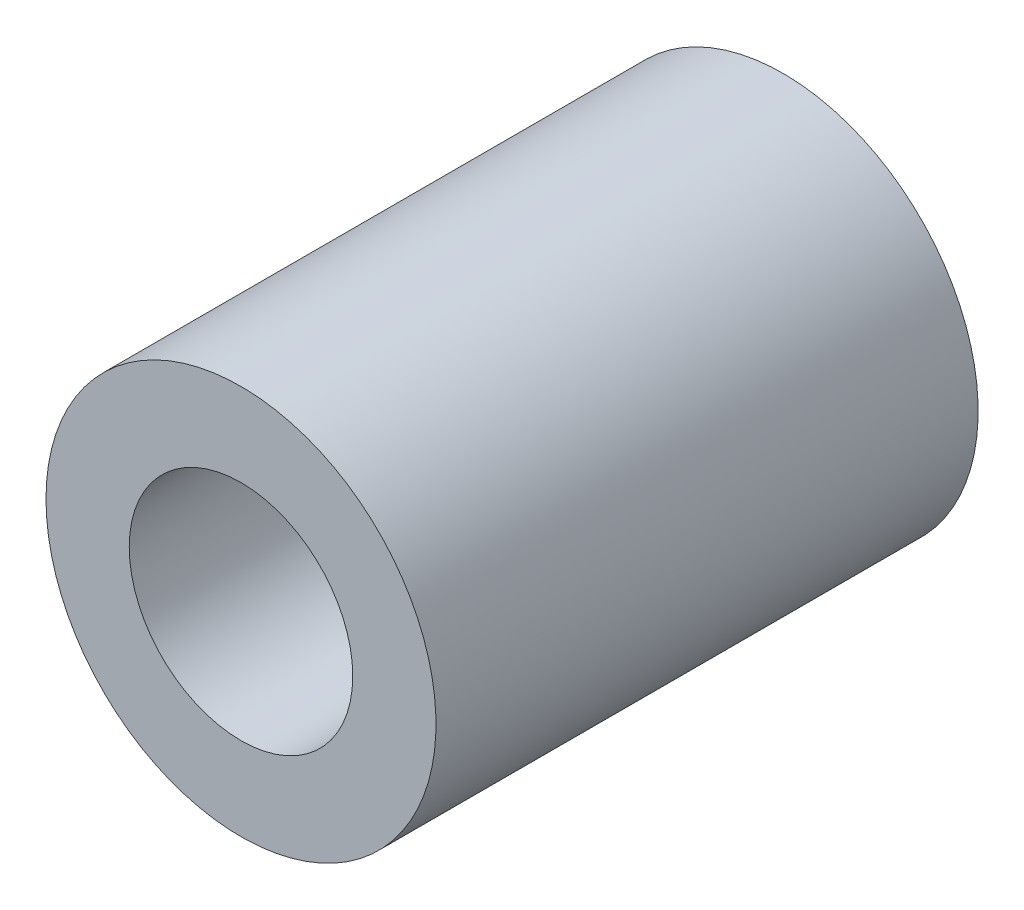
ISO-10303-21;
HEADER;
FILE_DESCRIPTION(('STEP AP214'),'2;1');
FILE_NAME('part.step','',(''),(''),'','','');
FILE_SCHEMA(('AUTOMOTIVE_DESIGN { 1 0 10303 214 1 1 1 1 }'));
ENDSEC;
DATA;
#1=APPLICATION_CONTEXT('core data for automotive mechanical design processes');
#2=APPLICATION_PROTOCOL_DEFINITION('international standard','automotive_design',2000,#1);
#3=PRODUCT_CONTEXT('',#1,'mechanical');
#4=PRODUCT('Part','Part','',(#3));
#5=PRODUCT_RELATED_PRODUCT_CATEGORY('part','',(#4));
#6=PRODUCT_DEFINITION_FORMATION('','',#4);
#7=PRODUCT_DEFINITION_CONTEXT('part definition',#1,'design');
#8=PRODUCT_DEFINITION('design','',#6,#7);
#9=PRODUCT_DEFINITION_SHAPE('','',#8);
#10=(LENGTH_UNIT() NAMED_UNIT(*) SI_UNIT(.MILLI.,.METRE.));
#11=(NAMED_UNIT(*) PLANE_ANGLE_UNIT() SI_UNIT($,.RADIAN.));
#12=(NAMED_UNIT(*) SI_UNIT($,.STERADIAN.) SOLID_ANGLE_UNIT());
#13=UNCERTAINTY_MEASURE_WITH_UNIT(LENGTH_MEASURE(1.E-05),#10,'distance_accuracy_value','');
#14=(GEOMETRIC_REPRESENTATION_CONTEXT(3) GLOBAL_UNCERTAINTY_ASSIGNED_CONTEXT((#13)) GLOBAL_UNIT_ASSIGNED_CONTEXT((#10,
#11,#12)) REPRESENTATION_CONTEXT('',''));
#15=CARTESIAN_POINT('',(0.,0.,0.));
#16=DIRECTION('',(0.,0.,1.));
#17=DIRECTION('',(1.,0.,0.));
#18=AXIS2_PLACEMENT_3D('',#15,#16,#17);
#19=CARTESIAN_POINT('',(0.,0.,114.));
#20=DIRECTION('',(0.,0.,1.));
#21=DIRECTION('',(1.,0.,0.));
#22=AXIS2_PLACEMENT_3D('',#19,#20,#21);
#23=PLANE('',#22);
#24=CARTESIAN_POINT('',(0.,0.,114.));
#25=DIRECTION('',(0.,0.,1.));
#26=DIRECTION('',(1.,0.,0.));
#27=AXIS2_PLACEMENT_3D('',#24,#25,#26);
#28=CIRCLE('',#27,41.);
#29=CARTESIAN_POINT('',(-41.,0.,114.));
#30=VERTEX_POINT('',#29);
#31=EDGE_CURVE('E10',#30,#30,#28,.T.);
#32=ORIENTED_EDGE('',*,*,#31,.T.);
#33=EDGE_LOOP('',(#32));
#34=FACE_BOUND('',#33,.T.);
#35=CARTESIAN_POINT('',(0.,0.,114.));
#36=DIRECTION('',(0.,0.,1.));
#37=DIRECTION('',(1.,0.,0.));
#38=AXIS2_PLACEMENT_3D('',#35,#36,#37);
#39=CIRCLE('',#38,23.5);
#40=CARTESIAN_POINT('',(-23.5,0.,114.));
#41=VERTEX_POINT('',#40);
#42=EDGE_CURVE('E54',#41,#41,#39,.T.);
#43=ORIENTED_EDGE('',*,*,#42,.F.);
#44=EDGE_LOOP('',(#43));
#45=FACE_BOUND('',#44,.T.);
#46=ADVANCED_FACE('F41',(#34,#45),#23,.T.);
#47=CARTESIAN_POINT('',(0.,0.,0.));
#48=DIRECTION('',(0.,0.,1.));
#49=DIRECTION('',(1.,0.,0.));
#50=AXIS2_PLACEMENT_3D('',#47,#48,#49);
#51=PLANE('',#50);
#52=CARTESIAN_POINT('',(0.,0.,0.));
#53=DIRECTION('',(0.,0.,1.));
#54=DIRECTION('',(1.,0.,0.));
#55=AXIS2_PLACEMENT_3D('',#52,#53,#54);
#56=CIRCLE('',#55,41.);
#57=CARTESIAN_POINT('',(-41.,0.,0.));
#58=VERTEX_POINT('',#57);
#59=EDGE_CURVE('E45',#58,#58,#56,.T.);
#60=ORIENTED_EDGE('',*,*,#59,.F.);
#61=EDGE_LOOP('',(#60));
#62=FACE_BOUND('',#61,.T.);
#63=CARTESIAN_POINT('',(0.,0.,0.));
#64=DIRECTION('',(0.,0.,1.));
#65=DIRECTION('',(1.,0.,0.));
#66=AXIS2_PLACEMENT_3D('',#63,#64,#65);
#67=CIRCLE('',#66,23.5);
#68=CARTESIAN_POINT('',(-23.5,0.,0.));
#69=VERTEX_POINT('',#68);
#70=EDGE_CURVE('E56',#69,#69,#67,.T.);
#71=ORIENTED_EDGE('',*,*,#70,.T.);
#72=EDGE_LOOP('',(#71));
#73=FACE_BOUND('',#72,.T.);
#74=ADVANCED_FACE('F68',(#62,#73),#51,.F.);
#75=CARTESIAN_POINT('',(0.,0.,114.));
#76=DIRECTION('',(0.,0.,-1.));
#77=DIRECTION('',(-1.,0.,0.));
#78=AXIS2_PLACEMENT_3D('',#75,#76,#77);
#79=CYLINDRICAL_SURFACE('',#78,41.);
#80=CARTESIAN_POINT('',(-41.,0.,114.));
#81=CARTESIAN_POINT('',(-41.,0.,112.8125));
#82=CARTESIAN_POINT('',(-41.,0.,111.625));
#83=CARTESIAN_POINT('',(-41.,0.,109.25));
#84=CARTESIAN_POINT('',(-41.,0.,108.0625));
#85=CARTESIAN_POINT('',(-41.,0.,105.6875));
#86=CARTESIAN_POINT('',(-41.,0.,104.5));
#87=CARTESIAN_POINT('',(-41.,0.,102.125));
#88=CARTESIAN_POINT('',(-41.,0.,100.9375));
#89=CARTESIAN_POINT('',(-41.,0.,98.5625));
#90=CARTESIAN_POINT('',(-41.,0.,97.375));
#91=CARTESIAN_POINT('',(-41.,0.,95.));
#92=CARTESIAN_POINT('',(-41.,0.,93.8125));
#93=CARTESIAN_POINT('',(-41.,0.,91.4375));
#94=CARTESIAN_POINT('',(-41.,0.,90.25));
#95=CARTESIAN_POINT('',(-41.,0.,87.875));
#96=CARTESIAN_POINT('',(-41.,0.,86.6875));
#97=CARTESIAN_POINT('',(-41.,0.,84.3125));
#98=CARTESIAN_POINT('',(-41.,0.,83.125));
#99=CARTESIAN_POINT('',(-41.,0.,80.75));
#100=CARTESIAN_POINT('',(-41.,0.,79.5625));
#101=CARTESIAN_POINT('',(-41.,0.,77.1875));
#102=CARTESIAN_POINT('',(-41.,0.,76.));
#103=CARTESIAN_POINT('',(-41.,0.,73.625));
#104=CARTESIAN_POINT('',(-41.,0.,72.4375));
#105=CARTESIAN_POINT('',(-41.,0.,70.0625));
#106=CARTESIAN_POINT('',(-41.,0.,68.875));
#107=CARTESIAN_POINT('',(-41.,0.,66.5));
#108=CARTESIAN_POINT('',(-41.,0.,65.3125));
#109=CARTESIAN_POINT('',(-41.,0.,62.9375));
#110=CARTESIAN_POINT('',(-41.,0.,61.75));
#111=CARTESIAN_POINT('',(-41.,0.,59.375));
#112=CARTESIAN_POINT('',(-41.,0.,58.1875));
#113=CARTESIAN_POINT('',(-41.,0.,55.8125));
#114=CARTESIAN_POINT('',(-41.,0.,54.625));
#115=CARTESIAN_POINT('',(-41.,0.,52.25));
#116=CARTESIAN_POINT('',(-41.,0.,51.0625));
#117=CARTESIAN_POINT('',(-41.,0.,48.6875));
#118=CARTESIAN_POINT('',(-41.,0.,47.5));
#119=CARTESIAN_POINT('',(-41.,0.,45.125));
#120=CARTESIAN_POINT('',(-41.,0.,43.9375));
#121=CARTESIAN_POINT('',(-41.,0.,41.5625));
#122=CARTESIAN_POINT('',(-41.,0.,40.375));
#123=CARTESIAN_POINT('',(-41.,0.,38.));
#124=CARTESIAN_POINT('',(-41.,0.,36.8125));
#125=CARTESIAN_POINT('',(-41.,0.,34.4375));
#126=CARTESIAN_POINT('',(-41.,0.,33.25));
#127=CARTESIAN_POINT('',(-41.,0.,30.875));
#128=CARTESIAN_POINT('',(-41.,0.,29.6875));
#129=CARTESIAN_POINT('',(-41.,0.,27.3125));
#130=CARTESIAN_POINT('',(-41.,0.,26.125));
#131=CARTESIAN_POINT('',(-41.,0.,23.75));
#132=CARTESIAN_POINT('',(-41.,0.,22.5625));
#133=CARTESIAN_POINT('',(-41.,0.,20.1875));
#134=CARTESIAN_POINT('',(-41.,0.,19.));
#135=CARTESIAN_POINT('',(-41.,0.,16.625));
#136=CARTESIAN_POINT('',(-41.,0.,15.4375));
#137=CARTESIAN_POINT('',(-41.,0.,13.0625));
#138=CARTESIAN_POINT('',(-41.,0.,11.875));
#139=CARTESIAN_POINT('',(-41.,0.,9.5));
#140=CARTESIAN_POINT('',(-41.,0.,8.31250000000001));
#141=CARTESIAN_POINT('',(-41.,0.,5.9375));
#142=CARTESIAN_POINT('',(-41.,0.,4.75));
#143=CARTESIAN_POINT('',(-41.,0.,2.375));
#144=CARTESIAN_POINT('',(-41.,0.,1.1875));
#145=CARTESIAN_POINT('',(-41.,0.,0.));
#146=B_SPLINE_CURVE_WITH_KNOTS('',3,(#80,#81,#82,#83,#84,#85,#86,#87,#88,#89,#90,#91,#92,#93,
#94,#95,#96,#97,#98,#99,#100,#101,#102,#103,#104,#105,#106,#107,#108,#109,#110,#111,#112,#113,
#114,#115,#116,#117,#118,#119,#120,#121,#122,#123,#124,#125,#126,#127,#128,#129,#130,#131,#132,
#133,#134,#135,#136,#137,#138,#139,#140,#141,#142,#143,#144,#145),.UNSPECIFIED.,.F.,.F.,(4,2,2,
2,2,2,2,2,2,2,2,2,2,2,2,2,2,2,2,2,2,2,2,2,2,2,2,2,2,2,2,2,4),(0.,3.5625,7.12499999999999,
10.6875,14.25,17.8125,21.375,24.9375,28.5,32.0625,35.625,39.1875,42.75,46.3125,49.875,53.4375,
57.,60.5625,64.125,67.6875,71.25,74.8125,78.375,81.9375,85.5,89.0625,92.625,96.1875,99.75,
103.3125,106.875,110.4375,114.),.UNSPECIFIED.);
#147=EDGE_CURVE('BSEAM43',#30,#58,#146,.T.);
#148=ORIENTED_EDGE('',*,*,#31,.F.);
#149=ORIENTED_EDGE('',*,*,#59,.T.);
#150=ORIENTED_EDGE('',*,*,#147,.T.);
#151=ORIENTED_EDGE('',*,*,#147,.F.);
#152=EDGE_LOOP('',(#148,#150,#149,#151));
#153=FACE_BOUND('',#152,.T.);
#154=ADVANCED_FACE('F43',(#153),#79,.T.);
#155=CARTESIAN_POINT('',(0.,0.,114.));
#156=DIRECTION('',(0.,0.,-1.));
#157=DIRECTION('',(-1.,0.,0.));
#158=AXIS2_PLACEMENT_3D('',#155,#156,#157);
#159=CYLINDRICAL_SURFACE('',#158,23.5);
#160=CARTESIAN_POINT('',(-23.5,0.,114.));
#161=CARTESIAN_POINT('',(-23.5,0.,112.8125));
#162=CARTESIAN_POINT('',(-23.5,0.,111.625));
#163=CARTESIAN_POINT('',(-23.5,0.,109.25));
#164=CARTESIAN_POINT('',(-23.5,0.,108.0625));
#165=CARTESIAN_POINT('',(-23.5,0.,105.6875));
#166=CARTESIAN_POINT('',(-23.5,0.,104.5));
#167=CARTESIAN_POINT('',(-23.5,0.,102.125));
#168=CARTESIAN_POINT('',(-23.5,0.,100.9375));
#169=CARTESIAN_POINT('',(-23.5,0.,98.5625));
#170=CARTESIAN_POINT('',(-23.5,0.,97.375));
#171=CARTESIAN_POINT('',(-23.5,0.,95.));
#172=CARTESIAN_POINT('',(-23.5,0.,93.8125));
#173=CARTESIAN_POINT('',(-23.5,0.,91.4375));
#174=CARTESIAN_POINT('',(-23.5,0.,90.25));
#175=CARTESIAN_POINT('',(-23.5,0.,87.875));
#176=CARTESIAN_POINT('',(-23.5,0.,86.6875));
#177=CARTESIAN_POINT('',(-23.5,0.,84.3125));
#178=CARTESIAN_POINT('',(-23.5,0.,83.125));
#179=CARTESIAN_POINT('',(-23.5,0.,80.75));
#180=CARTESIAN_POINT('',(-23.5,0.,79.5625));
#181=CARTESIAN_POINT('',(-23.5,0.,77.1875));
#182=CARTESIAN_POINT('',(-23.5,0.,76.));
#183=CARTESIAN_POINT('',(-23.5,0.,73.625));
#184=CARTESIAN_POINT('',(-23.5,0.,72.4375));
#185=CARTESIAN_POINT('',(-23.5,0.,70.0625));
#186=CARTESIAN_POINT('',(-23.5,0.,68.875));
#187=CARTESIAN_POINT('',(-23.5,0.,66.5));
#188=CARTESIAN_POINT('',(-23.5,0.,65.3125));
#189=CARTESIAN_POINT('',(-23.5,0.,62.9375));
#190=CARTESIAN_POINT('',(-23.5,0.,61.75));
#191=CARTESIAN_POINT('',(-23.5,0.,59.375));
#192=CARTESIAN_POINT('',(-23.5,0.,58.1875));
#193=CARTESIAN_POINT('',(-23.5,0.,55.8125));
#194=CARTESIAN_POINT('',(-23.5,0.,54.625));
#195=CARTESIAN_POINT('',(-23.5,0.,52.25));
#196=CARTESIAN_POINT('',(-23.5,0.,51.0625));
#197=CARTESIAN_POINT('',(-23.5,0.,48.6875));
#198=CARTESIAN_POINT('',(-23.5,0.,47.5));
#199=CARTESIAN_POINT('',(-23.5,0.,45.125));
#200=CARTESIAN_POINT('',(-23.5,0.,43.9375));
#201=CARTESIAN_POINT('',(-23.5,0.,41.5625));
#202=CARTESIAN_POINT('',(-23.5,0.,40.375));
#203=CARTESIAN_POINT('',(-23.5,0.,38.));
#204=CARTESIAN_POINT('',(-23.5,0.,36.8125));
#205=CARTESIAN_POINT('',(-23.5,0.,34.4375));
#206=CARTESIAN_POINT('',(-23.5,0.,33.25));
#207=CARTESIAN_POINT('',(-23.5,0.,30.875));
#208=CARTESIAN_POINT('',(-23.5,0.,29.6875));
#209=CARTESIAN_POINT('',(-23.5,0.,27.3125));
#210=CARTESIAN_POINT('',(-23.5,0.,26.125));
#211=CARTESIAN_POINT('',(-23.5,0.,23.75));
#212=CARTESIAN_POINT('',(-23.5,0.,22.5625));
#213=CARTESIAN_POINT('',(-23.5,0.,20.1875));
#214=CARTESIAN_POINT('',(-23.5,0.,19.));
#215=CARTESIAN_POINT('',(-23.5,0.,16.625));
#216=CARTESIAN_POINT('',(-23.5,0.,15.4375));
#217=CARTESIAN_POINT('',(-23.5,0.,13.0625));
#218=CARTESIAN_POINT('',(-23.5,0.,11.875));
#219=CARTESIAN_POINT('',(-23.5,0.,9.5));
#220=CARTESIAN_POINT('',(-23.5,0.,8.31250000000001));
#221=CARTESIAN_POINT('',(-23.5,0.,5.9375));
#222=CARTESIAN_POINT('',(-23.5,0.,4.75));
#223=CARTESIAN_POINT('',(-23.5,0.,2.375));
#224=CARTESIAN_POINT('',(-23.5,0.,1.1875));
#225=CARTESIAN_POINT('',(-23.5,0.,0.));
#226=B_SPLINE_CURVE_WITH_KNOTS('',3,(#160,#161,#162,#163,#164,#165,#166,#167,#168,#169,#170,
#171,#172,#173,#174,#175,#176,#177,#178,#179,#180,#181,#182,#183,#184,#185,#186,#187,#188,#189,
#190,#191,#192,#193,#194,#195,#196,#197,#198,#199,#200,#201,#202,#203,#204,#205,#206,#207,#208,
#209,#210,#211,#212,#213,#214,#215,#216,#217,#218,#219,#220,#221,#222,#223,#224,#225),
.UNSPECIFIED.,.F.,.F.,(4,2,2,2,2,2,2,2,2,2,2,2,2,2,2,2,2,2,2,2,2,2,2,2,2,2,2,2,2,2,2,2,4),(0.,
3.56250000000001,7.12500000000001,10.6875,14.25,17.8125,21.375,24.9375,28.5,32.0625,35.625,
39.1875,42.75,46.3125,49.875,53.4375,57.,60.5625,64.125,67.6875,71.25,74.8125,78.375,81.9375,
85.5,89.0625,92.625,96.1875,99.75,103.3125,106.875,110.4375,114.),.UNSPECIFIED.);
#227=EDGE_CURVE('BSEAM64',#41,#69,#226,.T.);
#228=ORIENTED_EDGE('',*,*,#42,.T.);
#229=ORIENTED_EDGE('',*,*,#70,.F.);
#230=ORIENTED_EDGE('',*,*,#227,.T.);
#231=ORIENTED_EDGE('',*,*,#227,.F.);
#232=EDGE_LOOP('',(#228,#230,#229,#231));
#233=FACE_BOUND('',#232,.T.);
#234=ADVANCED_FACE('F64',(#233),#159,.F.);
#235=CLOSED_SHELL('',(#46,#74,#154,#234));
#236=MANIFOLD_SOLID_BREP('B2',#235);
#237=ADVANCED_BREP_SHAPE_REPRESENTATION('',(#18,#236),#14);
#238=SHAPE_DEFINITION_REPRESENTATION(#9,#237);
ENDSEC;
END-ISO-10303-21;
